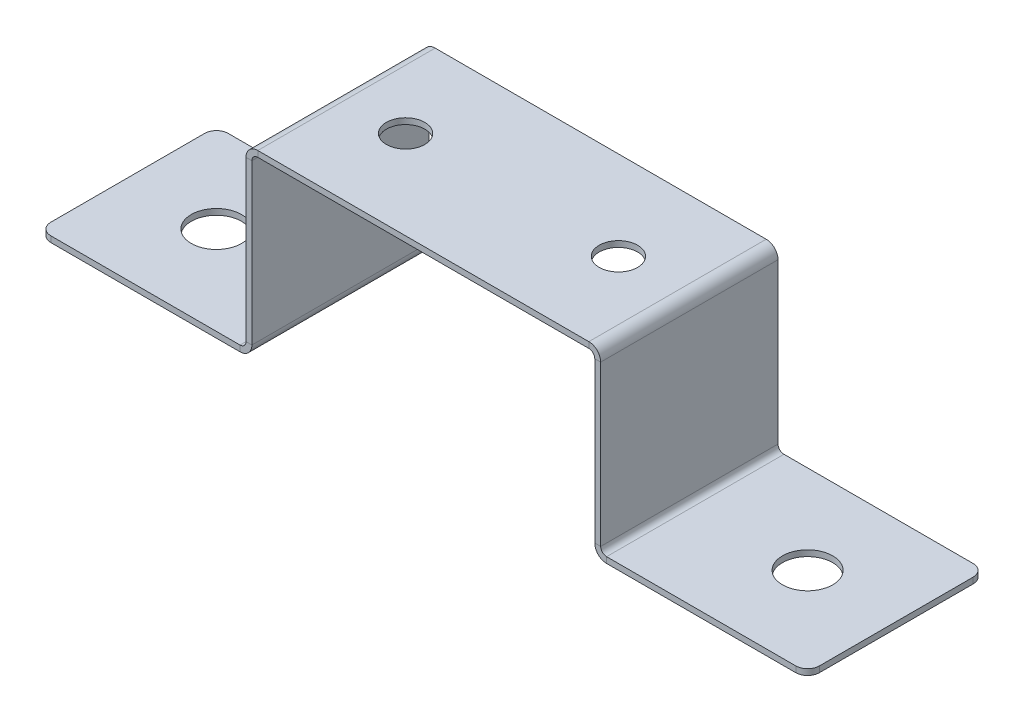
ISO-10303-21;
HEADER;
FILE_DESCRIPTION(('STEP AP214'),'2;1');
FILE_NAME('part.step','',(''),(''),'','','');
FILE_SCHEMA(('AUTOMOTIVE_DESIGN { 1 0 10303 214 1 1 1 1 }'));
ENDSEC;
DATA;
#1=APPLICATION_CONTEXT('core data for automotive mechanical design processes');
#2=APPLICATION_PROTOCOL_DEFINITION('international standard','automotive_design',2000,#1);
#3=PRODUCT_CONTEXT('',#1,'mechanical');
#4=PRODUCT('Part','Part','',(#3));
#5=PRODUCT_RELATED_PRODUCT_CATEGORY('part','',(#4));
#6=PRODUCT_DEFINITION_FORMATION('','',#4);
#7=PRODUCT_DEFINITION_CONTEXT('part definition',#1,'design');
#8=PRODUCT_DEFINITION('design','',#6,#7);
#9=PRODUCT_DEFINITION_SHAPE('','',#8);
#10=(LENGTH_UNIT() NAMED_UNIT(*) SI_UNIT(.MILLI.,.METRE.));
#11=(NAMED_UNIT(*) PLANE_ANGLE_UNIT() SI_UNIT($,.RADIAN.));
#12=(NAMED_UNIT(*) SI_UNIT($,.STERADIAN.) SOLID_ANGLE_UNIT());
#13=UNCERTAINTY_MEASURE_WITH_UNIT(LENGTH_MEASURE(1.E-05),#10,'distance_accuracy_value','');
#14=(GEOMETRIC_REPRESENTATION_CONTEXT(3) GLOBAL_UNCERTAINTY_ASSIGNED_CONTEXT((#13)) GLOBAL_UNIT_ASSIGNED_CONTEXT((#10,
#11,#12)) REPRESENTATION_CONTEXT('',''));
#15=CARTESIAN_POINT('',(0.,0.,0.));
#16=DIRECTION('',(0.,0.,1.));
#17=DIRECTION('',(1.,0.,0.));
#18=AXIS2_PLACEMENT_3D('',#15,#16,#17);
#19=CARTESIAN_POINT('',(65.,59.6862723900371,30.));
#20=DIRECTION('',(-1.,0.,0.));
#21=DIRECTION('',(0.,0.,1.));
#22=AXIS2_PLACEMENT_3D('',#19,#20,#21);
#23=PLANE('',#22);
#24=DIRECTION('',(0.,0.,-1.));
#25=VECTOR('',#24,1.);
#26=CARTESIAN_POINT('',(65.,-31.,30.));
#27=LINE('',#26,#25);
#28=CARTESIAN_POINT('',(65.,-31.,28.));
#29=VERTEX_POINT('',#28);
#30=CARTESIAN_POINT('',(65.,-31.,2.));
#31=VERTEX_POINT('',#30);
#32=EDGE_CURVE('E270',#29,#31,#27,.T.);
#33=ORIENTED_EDGE('',*,*,#32,.T.);
#34=DIRECTION('',(0.,-1.,0.));
#35=VECTOR('',#34,1.);
#36=CARTESIAN_POINT('',(65.,-30.,2.));
#37=LINE('',#36,#35);
#38=CARTESIAN_POINT('',(65.,-30.,2.));
#39=VERTEX_POINT('',#38);
#40=EDGE_CURVE('E286',#31,#39,#37,.F.);
#41=ORIENTED_EDGE('',*,*,#40,.T.);
#42=DIRECTION('',(0.,0.,-1.));
#43=VECTOR('',#42,1.);
#44=CARTESIAN_POINT('',(65.,-30.,30.));
#45=LINE('',#44,#43);
#46=CARTESIAN_POINT('',(65.,-30.,28.));
#47=VERTEX_POINT('',#46);
#48=EDGE_CURVE('E249',#47,#39,#45,.T.);
#49=ORIENTED_EDGE('',*,*,#48,.F.);
#50=DIRECTION('',(0.,-1.,0.));
#51=VECTOR('',#50,1.);
#52=CARTESIAN_POINT('',(65.,59.6862723900371,28.));
#53=LINE('',#52,#51);
#54=EDGE_CURVE('E283',#47,#29,#53,.T.);
#55=ORIENTED_EDGE('',*,*,#54,.T.);
#56=EDGE_LOOP('',(#33,#41,#49,#55));
#57=FACE_BOUND('',#56,.T.);
#58=ADVANCED_FACE('F37',(#57),#23,.F.);
#59=CARTESIAN_POINT('',(30.,59.6862723900371,30.));
#60=DIRECTION('',(0.,0.,-1.));
#61=DIRECTION('',(-1.,0.,0.));
#62=AXIS2_PLACEMENT_3D('',#59,#60,#61);
#63=PLANE('',#62);
#64=DIRECTION('',(1.,0.,0.));
#65=VECTOR('',#64,1.);
#66=CARTESIAN_POINT('',(30.,-31.,30.));
#67=LINE('',#66,#65);
#68=CARTESIAN_POINT('',(31.,-31.,30.));
#69=VERTEX_POINT('',#68);
#70=CARTESIAN_POINT('',(63.,-31.,30.));
#71=VERTEX_POINT('',#70);
#72=EDGE_CURVE('E264',#69,#71,#67,.T.);
#73=ORIENTED_EDGE('',*,*,#72,.T.);
#74=DIRECTION('',(0.,-1.,0.));
#75=VECTOR('',#74,1.);
#76=CARTESIAN_POINT('',(63.,59.6862723900371,30.));
#77=LINE('',#76,#75);
#78=CARTESIAN_POINT('',(63.,-30.,30.));
#79=VERTEX_POINT('',#78);
#80=EDGE_CURVE('E292',#71,#79,#77,.F.);
#81=ORIENTED_EDGE('',*,*,#80,.T.);
#82=DIRECTION('',(1.,0.,0.));
#83=VECTOR('',#82,1.);
#84=CARTESIAN_POINT('',(30.,-30.,30.));
#85=LINE('',#84,#83);
#86=CARTESIAN_POINT('',(31.,-30.,30.));
#87=VERTEX_POINT('',#86);
#88=EDGE_CURVE('E253',#87,#79,#85,.T.);
#89=ORIENTED_EDGE('',*,*,#88,.F.);
#90=DIRECTION('',(0.,-1.,0.));
#91=VECTOR('',#90,1.);
#92=CARTESIAN_POINT('',(31.,59.6862723900371,30.));
#93=LINE('',#92,#91);
#94=EDGE_CURVE('E267',#87,#69,#93,.T.);
#95=ORIENTED_EDGE('',*,*,#94,.T.);
#96=EDGE_LOOP('',(#73,#81,#89,#95));
#97=FACE_BOUND('',#96,.T.);
#98=ADVANCED_FACE('F490',(#97),#63,.F.);
#99=CARTESIAN_POINT('',(30.,-31.,30.));
#100=DIRECTION('',(0.,1.,0.));
#101=DIRECTION('',(0.,0.,1.));
#102=AXIS2_PLACEMENT_3D('',#99,#100,#101);
#103=PLANE('',#102);
#104=CARTESIAN_POINT('',(50.,-31.,15.));
#105=DIRECTION('',(0.,-1.,0.));
#106=DIRECTION('',(0.,0.,-1.));
#107=AXIS2_PLACEMENT_3D('',#104,#105,#106);
#108=CIRCLE('',#107,4.25000000000001);
#109=CARTESIAN_POINT('',(50.,-31.,10.75));
#110=VERTEX_POINT('',#109);
#111=EDGE_CURVE('E552',#110,#110,#108,.T.);
#112=ORIENTED_EDGE('',*,*,#111,.F.);
#113=EDGE_LOOP('',(#112));
#114=FACE_BOUND('',#113,.T.);
#115=DIRECTION('',(1.,0.,0.));
#116=VECTOR('',#115,1.);
#117=CARTESIAN_POINT('',(30.,-31.,0.));
#118=LINE('',#117,#116);
#119=CARTESIAN_POINT('',(31.,-31.,0.));
#120=VERTEX_POINT('',#119);
#121=CARTESIAN_POINT('',(63.,-31.,0.));
#122=VERTEX_POINT('',#121);
#123=EDGE_CURVE('E259',#120,#122,#118,.T.);
#124=ORIENTED_EDGE('',*,*,#123,.T.);
#125=CARTESIAN_POINT('',(63.,-31.,2.));
#126=DIRECTION('',(0.,1.,0.));
#127=DIRECTION('',(0.,0.,1.));
#128=AXIS2_PLACEMENT_3D('',#125,#126,#127);
#129=CIRCLE('',#128,2.);
#130=EDGE_CURVE('E281',#122,#31,#129,.F.);
#131=ORIENTED_EDGE('',*,*,#130,.T.);
#132=ORIENTED_EDGE('',*,*,#32,.F.);
#133=CARTESIAN_POINT('',(63.,-31.,28.));
#134=DIRECTION('',(0.,1.,0.));
#135=DIRECTION('',(0.,0.,1.));
#136=AXIS2_PLACEMENT_3D('',#133,#134,#135);
#137=CIRCLE('',#136,2.);
#138=EDGE_CURVE('E279',#29,#71,#137,.F.);
#139=ORIENTED_EDGE('',*,*,#138,.T.);
#140=ORIENTED_EDGE('',*,*,#72,.F.);
#141=DIRECTION('',(0.,0.,-1.));
#142=VECTOR('',#141,1.);
#143=CARTESIAN_POINT('',(31.,-31.,30.));
#144=LINE('',#143,#142);
#145=EDGE_CURVE('E262',#69,#120,#144,.T.);
#146=ORIENTED_EDGE('',*,*,#145,.T.);
#147=EDGE_LOOP('',(#124,#131,#132,#139,#140,#146));
#148=FACE_BOUND('',#147,.T.);
#149=ADVANCED_FACE('F496',(#114,#148),#103,.F.);
#150=CARTESIAN_POINT('',(30.,59.6862723900371,0.));
#151=DIRECTION('',(0.,0.,-1.));
#152=DIRECTION('',(-1.,0.,0.));
#153=AXIS2_PLACEMENT_3D('',#150,#151,#152);
#154=PLANE('',#153);
#155=DIRECTION('',(1.,0.,0.));
#156=VECTOR('',#155,1.);
#157=CARTESIAN_POINT('',(30.,-30.,0.));
#158=LINE('',#157,#156);
#159=CARTESIAN_POINT('',(31.,-30.,0.));
#160=VERTEX_POINT('',#159);
#161=CARTESIAN_POINT('',(63.,-30.,0.));
#162=VERTEX_POINT('',#161);
#163=EDGE_CURVE('E256',#160,#162,#158,.T.);
#164=ORIENTED_EDGE('',*,*,#163,.T.);
#165=DIRECTION('',(0.,-1.,0.));
#166=VECTOR('',#165,1.);
#167=CARTESIAN_POINT('',(63.,-31.,0.));
#168=LINE('',#167,#166);
#169=EDGE_CURVE('E252',#162,#122,#168,.T.);
#170=ORIENTED_EDGE('',*,*,#169,.T.);
#171=ORIENTED_EDGE('',*,*,#123,.F.);
#172=DIRECTION('',(0.,-1.,0.));
#173=VECTOR('',#172,1.);
#174=CARTESIAN_POINT('',(31.,59.6862723900371,0.));
#175=LINE('',#174,#173);
#176=EDGE_CURVE('E219',#160,#120,#175,.T.);
#177=ORIENTED_EDGE('',*,*,#176,.F.);
#178=EDGE_LOOP('',(#164,#170,#171,#177));
#179=FACE_BOUND('',#178,.T.);
#180=ADVANCED_FACE('F504',(#179),#154,.T.);
#181=CARTESIAN_POINT('',(30.,-30.,30.));
#182=DIRECTION('',(0.,1.,0.));
#183=DIRECTION('',(0.,0.,1.));
#184=AXIS2_PLACEMENT_3D('',#181,#182,#183);
#185=PLANE('',#184);
#186=CARTESIAN_POINT('',(50.,-30.,15.));
#187=DIRECTION('',(0.,1.,0.));
#188=DIRECTION('',(0.,0.,1.));
#189=AXIS2_PLACEMENT_3D('',#186,#187,#188);
#190=CIRCLE('',#189,4.25000000000001);
#191=CARTESIAN_POINT('',(50.,-30.,19.25));
#192=VERTEX_POINT('',#191);
#193=EDGE_CURVE('E549',#192,#192,#190,.F.);
#194=ORIENTED_EDGE('',*,*,#193,.T.);
#195=EDGE_LOOP('',(#194));
#196=FACE_BOUND('',#195,.T.);
#197=ORIENTED_EDGE('',*,*,#48,.T.);
#198=CARTESIAN_POINT('',(63.,-30.,2.));
#199=DIRECTION('',(0.,1.,0.));
#200=DIRECTION('',(0.,0.,1.));
#201=AXIS2_PLACEMENT_3D('',#198,#199,#200);
#202=CIRCLE('',#201,2.);
#203=EDGE_CURVE('E290',#39,#162,#202,.T.);
#204=ORIENTED_EDGE('',*,*,#203,.T.);
#205=ORIENTED_EDGE('',*,*,#163,.F.);
#206=DIRECTION('',(0.,0.,-1.));
#207=VECTOR('',#206,1.);
#208=CARTESIAN_POINT('',(31.,-30.,30.));
#209=LINE('',#208,#207);
#210=EDGE_CURVE('E274',#87,#160,#209,.T.);
#211=ORIENTED_EDGE('',*,*,#210,.F.);
#212=ORIENTED_EDGE('',*,*,#88,.T.);
#213=CARTESIAN_POINT('',(63.,-30.,28.));
#214=DIRECTION('',(0.,1.,0.));
#215=DIRECTION('',(0.,0.,1.));
#216=AXIS2_PLACEMENT_3D('',#213,#214,#215);
#217=CIRCLE('',#216,2.);
#218=EDGE_CURVE('E288',#79,#47,#217,.T.);
#219=ORIENTED_EDGE('',*,*,#218,.T.);
#220=EDGE_LOOP('',(#197,#204,#205,#211,#212,#219));
#221=FACE_BOUND('',#220,.T.);
#222=ADVANCED_FACE('F508',(#196,#221),#185,.T.);
#223=CARTESIAN_POINT('',(-51.7217442824423,0.,0.));
#224=DIRECTION('',(0.,0.,1.));
#225=DIRECTION('',(0.,-1.,0.));
#226=AXIS2_PLACEMENT_3D('',#223,#224,#225);
#227=PLANE('',#226);
#228=DIRECTION('',(0.,1.,0.));
#229=VECTOR('',#228,1.);
#230=CARTESIAN_POINT('',(30.,0.,0.));
#231=LINE('',#230,#229);
#232=CARTESIAN_POINT('',(30.,-29.,0.));
#233=VERTEX_POINT('',#232);
#234=CARTESIAN_POINT('',(30.,-1.99999999999999,0.));
#235=VERTEX_POINT('',#234);
#236=EDGE_CURVE('E234',#233,#235,#231,.T.);
#237=ORIENTED_EDGE('',*,*,#236,.F.);
#238=DIRECTION('',(1.,0.,0.));
#239=VECTOR('',#238,1.);
#240=CARTESIAN_POINT('',(-51.7217442824423,-29.,0.));
#241=LINE('',#240,#239);
#242=CARTESIAN_POINT('',(29.,-29.,0.));
#243=VERTEX_POINT('',#242);
#244=EDGE_CURVE('E216',#243,#233,#241,.T.);
#245=ORIENTED_EDGE('',*,*,#244,.F.);
#246=DIRECTION('',(0.,1.,0.));
#247=VECTOR('',#246,1.);
#248=CARTESIAN_POINT('',(29.,0.,0.));
#249=LINE('',#248,#247);
#250=CARTESIAN_POINT('',(29.,-1.99999999999999,0.));
#251=VERTEX_POINT('',#250);
#252=EDGE_CURVE('E224',#243,#251,#249,.T.);
#253=ORIENTED_EDGE('',*,*,#252,.T.);
#254=DIRECTION('',(1.,0.,0.));
#255=VECTOR('',#254,1.);
#256=CARTESIAN_POINT('',(-51.7217442824423,-1.99999999999999,0.));
#257=LINE('',#256,#255);
#258=EDGE_CURVE('E230',#251,#235,#257,.T.);
#259=ORIENTED_EDGE('',*,*,#258,.T.);
#260=EDGE_LOOP('',(#237,#245,#253,#259));
#261=FACE_BOUND('',#260,.T.);
#262=ADVANCED_FACE('F233',(#261),#227,.F.);
#263=CARTESIAN_POINT('',(30.,0.,30.));
#264=DIRECTION('',(1.,0.,0.));
#265=DIRECTION('',(0.,0.,-1.));
#266=AXIS2_PLACEMENT_3D('',#263,#264,#265);
#267=PLANE('',#266);
#268=DIRECTION('',(0.,0.,1.));
#269=VECTOR('',#268,1.);
#270=CARTESIAN_POINT('',(30.,-29.,30.));
#271=LINE('',#270,#269);
#272=CARTESIAN_POINT('',(30.,-29.,30.));
#273=VERTEX_POINT('',#272);
#274=EDGE_CURVE('E236',#233,#273,#271,.T.);
#275=ORIENTED_EDGE('',*,*,#274,.F.);
#276=ORIENTED_EDGE('',*,*,#236,.T.);
#277=DIRECTION('',(0.,0.,-1.));
#278=VECTOR('',#277,1.);
#279=CARTESIAN_POINT('',(30.,-1.99999999999999,0.));
#280=LINE('',#279,#278);
#281=CARTESIAN_POINT('',(30.,-2.,30.));
#282=VERTEX_POINT('',#281);
#283=EDGE_CURVE('E239',#282,#235,#280,.T.);
#284=ORIENTED_EDGE('',*,*,#283,.F.);
#285=DIRECTION('',(0.,-1.,0.));
#286=VECTOR('',#285,1.);
#287=CARTESIAN_POINT('',(30.,0.,30.));
#288=LINE('',#287,#286);
#289=EDGE_CURVE('E348',#282,#273,#288,.T.);
#290=ORIENTED_EDGE('',*,*,#289,.T.);
#291=EDGE_LOOP('',(#275,#276,#284,#290));
#292=FACE_BOUND('',#291,.T.);
#293=ADVANCED_FACE('F664',(#292),#267,.T.);
#294=CARTESIAN_POINT('',(-51.7217442824423,0.,30.));
#295=DIRECTION('',(0.,0.,1.));
#296=DIRECTION('',(0.,-1.,0.));
#297=AXIS2_PLACEMENT_3D('',#294,#295,#296);
#298=PLANE('',#297);
#299=DIRECTION('',(1.,0.,0.));
#300=VECTOR('',#299,1.);
#301=CARTESIAN_POINT('',(-51.7217442824423,-29.,30.));
#302=LINE('',#301,#300);
#303=CARTESIAN_POINT('',(29.,-29.,30.));
#304=VERTEX_POINT('',#303);
#305=EDGE_CURVE('E345',#304,#273,#302,.T.);
#306=ORIENTED_EDGE('',*,*,#305,.T.);
#307=ORIENTED_EDGE('',*,*,#289,.F.);
#308=DIRECTION('',(1.,0.,0.));
#309=VECTOR('',#308,1.);
#310=CARTESIAN_POINT('',(-51.7217442824423,-1.99999999999999,30.));
#311=LINE('',#310,#309);
#312=CARTESIAN_POINT('',(29.,-2.,30.));
#313=VERTEX_POINT('',#312);
#314=EDGE_CURVE('E245',#313,#282,#311,.T.);
#315=ORIENTED_EDGE('',*,*,#314,.F.);
#316=DIRECTION('',(0.,1.,0.));
#317=VECTOR('',#316,1.);
#318=CARTESIAN_POINT('',(29.,0.,30.));
#319=LINE('',#318,#317);
#320=EDGE_CURVE('E211',#313,#304,#319,.F.);
#321=ORIENTED_EDGE('',*,*,#320,.T.);
#322=EDGE_LOOP('',(#306,#307,#315,#321));
#323=FACE_BOUND('',#322,.T.);
#324=ADVANCED_FACE('F666',(#323),#298,.T.);
#325=CARTESIAN_POINT('',(29.,0.,30.));
#326=DIRECTION('',(1.,0.,0.));
#327=DIRECTION('',(0.,0.,-1.));
#328=AXIS2_PLACEMENT_3D('',#325,#326,#327);
#329=PLANE('',#328);
#330=ORIENTED_EDGE('',*,*,#252,.F.);
#331=DIRECTION('',(0.,0.,1.));
#332=VECTOR('',#331,1.);
#333=CARTESIAN_POINT('',(29.,-29.,30.));
#334=LINE('',#333,#332);
#335=EDGE_CURVE('E200',#243,#304,#334,.T.);
#336=ORIENTED_EDGE('',*,*,#335,.T.);
#337=ORIENTED_EDGE('',*,*,#320,.F.);
#338=DIRECTION('',(0.,0.,-1.));
#339=VECTOR('',#338,1.);
#340=CARTESIAN_POINT('',(29.,-1.99999999999999,0.));
#341=LINE('',#340,#339);
#342=EDGE_CURVE('E210',#313,#251,#341,.T.);
#343=ORIENTED_EDGE('',*,*,#342,.T.);
#344=EDGE_LOOP('',(#330,#336,#337,#343));
#345=FACE_BOUND('',#344,.T.);
#346=ADVANCED_FACE('F225',(#345),#329,.F.);
#347=CARTESIAN_POINT('',(-65.,59.6862723900371,30.));
#348=DIRECTION('',(-1.,0.,0.));
#349=DIRECTION('',(0.,0.,1.));
#350=AXIS2_PLACEMENT_3D('',#347,#348,#349);
#351=PLANE('',#350);
#352=DIRECTION('',(0.,0.,-1.));
#353=VECTOR('',#352,1.);
#354=CARTESIAN_POINT('',(-65.,-30.,30.));
#355=LINE('',#354,#353);
#356=CARTESIAN_POINT('',(-65.,-30.,28.));
#357=VERTEX_POINT('',#356);
#358=CARTESIAN_POINT('',(-65.,-30.,2.));
#359=VERTEX_POINT('',#358);
#360=EDGE_CURVE('E307',#357,#359,#355,.T.);
#361=ORIENTED_EDGE('',*,*,#360,.T.);
#362=DIRECTION('',(0.,-1.,0.));
#363=VECTOR('',#362,1.);
#364=CARTESIAN_POINT('',(-65.,59.6862723900371,2.));
#365=LINE('',#364,#363);
#366=CARTESIAN_POINT('',(-65.,-31.,2.));
#367=VERTEX_POINT('',#366);
#368=EDGE_CURVE('E296',#359,#367,#365,.T.);
#369=ORIENTED_EDGE('',*,*,#368,.T.);
#370=DIRECTION('',(0.,0.,-1.));
#371=VECTOR('',#370,1.);
#372=CARTESIAN_POINT('',(-65.,-31.,30.));
#373=LINE('',#372,#371);
#374=CARTESIAN_POINT('',(-65.,-31.,28.));
#375=VERTEX_POINT('',#374);
#376=EDGE_CURVE('E325',#375,#367,#373,.T.);
#377=ORIENTED_EDGE('',*,*,#376,.F.);
#378=DIRECTION('',(0.,-1.,0.));
#379=VECTOR('',#378,1.);
#380=CARTESIAN_POINT('',(-65.,-30.,28.));
#381=LINE('',#380,#379);
#382=EDGE_CURVE('E294',#375,#357,#381,.F.);
#383=ORIENTED_EDGE('',*,*,#382,.T.);
#384=EDGE_LOOP('',(#361,#369,#377,#383));
#385=FACE_BOUND('',#384,.T.);
#386=ADVANCED_FACE('F313',(#385),#351,.T.);
#387=CARTESIAN_POINT('',(-65.,59.6862723900371,0.));
#388=DIRECTION('',(0.,0.,-1.));
#389=DIRECTION('',(-1.,0.,0.));
#390=AXIS2_PLACEMENT_3D('',#387,#388,#389);
#391=PLANE('',#390);
#392=DIRECTION('',(1.,0.,0.));
#393=VECTOR('',#392,1.);
#394=CARTESIAN_POINT('',(-65.,-31.,0.));
#395=LINE('',#394,#393);
#396=CARTESIAN_POINT('',(-63.,-31.,0.));
#397=VERTEX_POINT('',#396);
#398=CARTESIAN_POINT('',(-31.,-31.,0.));
#399=VERTEX_POINT('',#398);
#400=EDGE_CURVE('E323',#397,#399,#395,.T.);
#401=ORIENTED_EDGE('',*,*,#400,.F.);
#402=DIRECTION('',(0.,-1.,0.));
#403=VECTOR('',#402,1.);
#404=CARTESIAN_POINT('',(-63.,59.6862723900371,0.));
#405=LINE('',#404,#403);
#406=CARTESIAN_POINT('',(-63.,-30.,0.));
#407=VERTEX_POINT('',#406);
#408=EDGE_CURVE('E60',#397,#407,#405,.F.);
#409=ORIENTED_EDGE('',*,*,#408,.T.);
#410=DIRECTION('',(1.,0.,0.));
#411=VECTOR('',#410,1.);
#412=CARTESIAN_POINT('',(-65.,-30.,0.));
#413=LINE('',#412,#411);
#414=CARTESIAN_POINT('',(-31.,-30.,0.));
#415=VERTEX_POINT('',#414);
#416=EDGE_CURVE('E309',#407,#415,#413,.T.);
#417=ORIENTED_EDGE('',*,*,#416,.T.);
#418=DIRECTION('',(0.,-1.,0.));
#419=VECTOR('',#418,1.);
#420=CARTESIAN_POINT('',(-31.,59.6862723900371,0.));
#421=LINE('',#420,#419);
#422=EDGE_CURVE('E329',#415,#399,#421,.T.);
#423=ORIENTED_EDGE('',*,*,#422,.T.);
#424=EDGE_LOOP('',(#401,#409,#417,#423));
#425=FACE_BOUND('',#424,.T.);
#426=ADVANCED_FACE('F327',(#425),#391,.T.);
#427=CARTESIAN_POINT('',(-65.,-31.,30.));
#428=DIRECTION('',(0.,1.,0.));
#429=DIRECTION('',(0.,0.,1.));
#430=AXIS2_PLACEMENT_3D('',#427,#428,#429);
#431=PLANE('',#430);
#432=CARTESIAN_POINT('',(-50.,-31.,15.));
#433=DIRECTION('',(0.,-1.,0.));
#434=DIRECTION('',(0.,0.,-1.));
#435=AXIS2_PLACEMENT_3D('',#432,#433,#434);
#436=CIRCLE('',#435,4.25);
#437=CARTESIAN_POINT('',(-50.,-31.,10.75));
#438=VERTEX_POINT('',#437);
#439=EDGE_CURVE('E543',#438,#438,#436,.T.);
#440=ORIENTED_EDGE('',*,*,#439,.F.);
#441=EDGE_LOOP('',(#440));
#442=FACE_BOUND('',#441,.T.);
#443=ORIENTED_EDGE('',*,*,#376,.T.);
#444=CARTESIAN_POINT('',(-63.,-31.,2.));
#445=DIRECTION('',(0.,1.,0.));
#446=DIRECTION('',(0.,0.,1.));
#447=AXIS2_PLACEMENT_3D('',#444,#445,#446);
#448=CIRCLE('',#447,2.);
#449=EDGE_CURVE('E301',#367,#397,#448,.F.);
#450=ORIENTED_EDGE('',*,*,#449,.T.);
#451=ORIENTED_EDGE('',*,*,#400,.T.);
#452=DIRECTION('',(0.,0.,1.));
#453=VECTOR('',#452,1.);
#454=CARTESIAN_POINT('',(-31.,-31.,0.));
#455=LINE('',#454,#453);
#456=CARTESIAN_POINT('',(-31.,-31.,30.));
#457=VERTEX_POINT('',#456);
#458=EDGE_CURVE('E330',#399,#457,#455,.T.);
#459=ORIENTED_EDGE('',*,*,#458,.T.);
#460=DIRECTION('',(1.,0.,0.));
#461=VECTOR('',#460,1.);
#462=CARTESIAN_POINT('',(-65.,-31.,30.));
#463=LINE('',#462,#461);
#464=CARTESIAN_POINT('',(-63.,-31.,30.));
#465=VERTEX_POINT('',#464);
#466=EDGE_CURVE('E465',#465,#457,#463,.T.);
#467=ORIENTED_EDGE('',*,*,#466,.F.);
#468=CARTESIAN_POINT('',(-63.,-31.,28.));
#469=DIRECTION('',(0.,1.,0.));
#470=DIRECTION('',(0.,0.,1.));
#471=AXIS2_PLACEMENT_3D('',#468,#469,#470);
#472=CIRCLE('',#471,2.);
#473=EDGE_CURVE('E299',#465,#375,#472,.F.);
#474=ORIENTED_EDGE('',*,*,#473,.T.);
#475=EDGE_LOOP('',(#443,#450,#451,#459,#467,#474));
#476=FACE_BOUND('',#475,.T.);
#477=ADVANCED_FACE('F321',(#442,#476),#431,.F.);
#478=CARTESIAN_POINT('',(-65.,59.6862723900371,30.));
#479=DIRECTION('',(0.,0.,-1.));
#480=DIRECTION('',(-1.,0.,0.));
#481=AXIS2_PLACEMENT_3D('',#478,#479,#480);
#482=PLANE('',#481);
#483=DIRECTION('',(1.,0.,0.));
#484=VECTOR('',#483,1.);
#485=CARTESIAN_POINT('',(-65.,-30.,30.));
#486=LINE('',#485,#484);
#487=CARTESIAN_POINT('',(-63.,-30.,30.));
#488=VERTEX_POINT('',#487);
#489=CARTESIAN_POINT('',(-31.,-30.,30.));
#490=VERTEX_POINT('',#489);
#491=EDGE_CURVE('E248',#488,#490,#486,.T.);
#492=ORIENTED_EDGE('',*,*,#491,.F.);
#493=DIRECTION('',(0.,-1.,0.));
#494=VECTOR('',#493,1.);
#495=CARTESIAN_POINT('',(-63.,-31.,30.));
#496=LINE('',#495,#494);
#497=EDGE_CURVE('E11',#488,#465,#496,.T.);
#498=ORIENTED_EDGE('',*,*,#497,.T.);
#499=ORIENTED_EDGE('',*,*,#466,.T.);
#500=DIRECTION('',(0.,-1.,0.));
#501=VECTOR('',#500,1.);
#502=CARTESIAN_POINT('',(-31.,59.6862723900371,30.));
#503=LINE('',#502,#501);
#504=EDGE_CURVE('E317',#490,#457,#503,.T.);
#505=ORIENTED_EDGE('',*,*,#504,.F.);
#506=EDGE_LOOP('',(#492,#498,#499,#505));
#507=FACE_BOUND('',#506,.T.);
#508=ADVANCED_FACE('F470',(#507),#482,.F.);
#509=CARTESIAN_POINT('',(-65.,-30.,30.));
#510=DIRECTION('',(0.,1.,0.));
#511=DIRECTION('',(0.,0.,1.));
#512=AXIS2_PLACEMENT_3D('',#509,#510,#511);
#513=PLANE('',#512);
#514=CARTESIAN_POINT('',(-50.,-30.,15.));
#515=DIRECTION('',(0.,1.,0.));
#516=DIRECTION('',(0.,0.,1.));
#517=AXIS2_PLACEMENT_3D('',#514,#515,#516);
#518=CIRCLE('',#517,4.25);
#519=CARTESIAN_POINT('',(-50.,-30.,19.25));
#520=VERTEX_POINT('',#519);
#521=EDGE_CURVE('E545',#520,#520,#518,.F.);
#522=ORIENTED_EDGE('',*,*,#521,.T.);
#523=EDGE_LOOP('',(#522));
#524=FACE_BOUND('',#523,.T.);
#525=ORIENTED_EDGE('',*,*,#416,.F.);
#526=CARTESIAN_POINT('',(-63.,-30.,2.));
#527=DIRECTION('',(0.,1.,0.));
#528=DIRECTION('',(0.,0.,1.));
#529=AXIS2_PLACEMENT_3D('',#526,#527,#528);
#530=CIRCLE('',#529,2.);
#531=EDGE_CURVE('E45',#407,#359,#530,.T.);
#532=ORIENTED_EDGE('',*,*,#531,.T.);
#533=ORIENTED_EDGE('',*,*,#360,.F.);
#534=CARTESIAN_POINT('',(-63.,-30.,28.));
#535=DIRECTION('',(0.,1.,0.));
#536=DIRECTION('',(0.,0.,1.));
#537=AXIS2_PLACEMENT_3D('',#534,#535,#536);
#538=CIRCLE('',#537,2.);
#539=EDGE_CURVE('E52',#357,#488,#538,.T.);
#540=ORIENTED_EDGE('',*,*,#539,.T.);
#541=ORIENTED_EDGE('',*,*,#491,.T.);
#542=DIRECTION('',(0.,0.,1.));
#543=VECTOR('',#542,1.);
#544=CARTESIAN_POINT('',(-31.,-30.,0.));
#545=LINE('',#544,#543);
#546=EDGE_CURVE('E339',#415,#490,#545,.T.);
#547=ORIENTED_EDGE('',*,*,#546,.F.);
#548=EDGE_LOOP('',(#525,#532,#533,#540,#541,#547));
#549=FACE_BOUND('',#548,.T.);
#550=ADVANCED_FACE('F306',(#524,#549),#513,.T.);
#551=CARTESIAN_POINT('',(51.7217442824423,-30.,30.));
#552=DIRECTION('',(0.,0.,1.));
#553=DIRECTION('',(0.,1.,0.));
#554=AXIS2_PLACEMENT_3D('',#551,#552,#553);
#555=PLANE('',#554);
#556=DIRECTION('',(-1.,0.,0.));
#557=VECTOR('',#556,1.);
#558=CARTESIAN_POINT('',(51.7217442824423,-1.99999999999999,30.));
#559=LINE('',#558,#557);
#560=CARTESIAN_POINT('',(-29.,-1.99999999999999,30.));
#561=VERTEX_POINT('',#560);
#562=CARTESIAN_POINT('',(-30.,-1.99999999999999,30.));
#563=VERTEX_POINT('',#562);
#564=EDGE_CURVE('E452',#561,#563,#559,.T.);
#565=ORIENTED_EDGE('',*,*,#564,.T.);
#566=DIRECTION('',(0.,-1.,0.));
#567=VECTOR('',#566,1.);
#568=CARTESIAN_POINT('',(-30.,-30.,30.));
#569=LINE('',#568,#567);
#570=CARTESIAN_POINT('',(-30.,-29.,30.));
#571=VERTEX_POINT('',#570);
#572=EDGE_CURVE('E449',#563,#571,#569,.T.);
#573=ORIENTED_EDGE('',*,*,#572,.T.);
#574=DIRECTION('',(-1.,0.,0.));
#575=VECTOR('',#574,1.);
#576=CARTESIAN_POINT('',(51.7217442824423,-29.,30.));
#577=LINE('',#576,#575);
#578=CARTESIAN_POINT('',(-29.,-29.,30.));
#579=VERTEX_POINT('',#578);
#580=EDGE_CURVE('E454',#579,#571,#577,.T.);
#581=ORIENTED_EDGE('',*,*,#580,.F.);
#582=DIRECTION('',(0.,-1.,0.));
#583=VECTOR('',#582,1.);
#584=CARTESIAN_POINT('',(-29.,-30.,30.));
#585=LINE('',#584,#583);
#586=EDGE_CURVE('E440',#561,#579,#585,.T.);
#587=ORIENTED_EDGE('',*,*,#586,.F.);
#588=EDGE_LOOP('',(#565,#573,#581,#587));
#589=FACE_BOUND('',#588,.T.);
#590=ADVANCED_FACE('F613',(#589),#555,.T.);
#591=CARTESIAN_POINT('',(-30.,-30.,30.));
#592=DIRECTION('',(-1.,0.,0.));
#593=DIRECTION('',(0.,0.,1.));
#594=AXIS2_PLACEMENT_3D('',#591,#592,#593);
#595=PLANE('',#594);
#596=DIRECTION('',(0.,0.,-1.));
#597=VECTOR('',#596,1.);
#598=CARTESIAN_POINT('',(-30.,-29.,0.));
#599=LINE('',#598,#597);
#600=CARTESIAN_POINT('',(-30.,-29.,0.));
#601=VERTEX_POINT('',#600);
#602=EDGE_CURVE('E456',#571,#601,#599,.T.);
#603=ORIENTED_EDGE('',*,*,#602,.F.);
#604=ORIENTED_EDGE('',*,*,#572,.F.);
#605=DIRECTION('',(0.,0.,1.));
#606=VECTOR('',#605,1.);
#607=CARTESIAN_POINT('',(-30.,-1.99999999999999,30.));
#608=LINE('',#607,#606);
#609=CARTESIAN_POINT('',(-30.,-2.,0.));
#610=VERTEX_POINT('',#609);
#611=EDGE_CURVE('E459',#610,#563,#608,.T.);
#612=ORIENTED_EDGE('',*,*,#611,.F.);
#613=DIRECTION('',(0.,1.,0.));
#614=VECTOR('',#613,1.);
#615=CARTESIAN_POINT('',(-30.,-30.,0.));
#616=LINE('',#615,#614);
#617=EDGE_CURVE('E446',#601,#610,#616,.T.);
#618=ORIENTED_EDGE('',*,*,#617,.F.);
#619=EDGE_LOOP('',(#603,#604,#612,#618));
#620=FACE_BOUND('',#619,.T.);
#621=ADVANCED_FACE('F615',(#620),#595,.T.);
#622=CARTESIAN_POINT('',(51.7217442824423,-30.,0.));
#623=DIRECTION('',(0.,0.,1.));
#624=DIRECTION('',(0.,1.,0.));
#625=AXIS2_PLACEMENT_3D('',#622,#623,#624);
#626=PLANE('',#625);
#627=ORIENTED_EDGE('',*,*,#617,.T.);
#628=DIRECTION('',(-1.,0.,0.));
#629=VECTOR('',#628,1.);
#630=CARTESIAN_POINT('',(51.7217442824423,-1.99999999999999,0.));
#631=LINE('',#630,#629);
#632=CARTESIAN_POINT('',(-29.,-2.,0.));
#633=VERTEX_POINT('',#632);
#634=EDGE_CURVE('E431',#633,#610,#631,.T.);
#635=ORIENTED_EDGE('',*,*,#634,.F.);
#636=DIRECTION('',(0.,1.,0.));
#637=VECTOR('',#636,1.);
#638=CARTESIAN_POINT('',(-29.,-30.,0.));
#639=LINE('',#638,#637);
#640=CARTESIAN_POINT('',(-29.,-29.,0.));
#641=VERTEX_POINT('',#640);
#642=EDGE_CURVE('E434',#641,#633,#639,.T.);
#643=ORIENTED_EDGE('',*,*,#642,.F.);
#644=DIRECTION('',(-1.,0.,0.));
#645=VECTOR('',#644,1.);
#646=CARTESIAN_POINT('',(51.7217442824423,-29.,0.));
#647=LINE('',#646,#645);
#648=EDGE_CURVE('E443',#641,#601,#647,.T.);
#649=ORIENTED_EDGE('',*,*,#648,.T.);
#650=EDGE_LOOP('',(#627,#635,#643,#649));
#651=FACE_BOUND('',#650,.T.);
#652=ADVANCED_FACE('F644',(#651),#626,.F.);
#653=CARTESIAN_POINT('',(-29.,-30.,30.));
#654=DIRECTION('',(-1.,0.,0.));
#655=DIRECTION('',(0.,0.,1.));
#656=AXIS2_PLACEMENT_3D('',#653,#654,#655);
#657=PLANE('',#656);
#658=ORIENTED_EDGE('',*,*,#586,.T.);
#659=DIRECTION('',(0.,0.,-1.));
#660=VECTOR('',#659,1.);
#661=CARTESIAN_POINT('',(-29.,-29.,0.));
#662=LINE('',#661,#660);
#663=EDGE_CURVE('E437',#579,#641,#662,.T.);
#664=ORIENTED_EDGE('',*,*,#663,.T.);
#665=ORIENTED_EDGE('',*,*,#642,.T.);
#666=DIRECTION('',(0.,0.,1.));
#667=VECTOR('',#666,1.);
#668=CARTESIAN_POINT('',(-29.,-1.99999999999999,30.));
#669=LINE('',#668,#667);
#670=EDGE_CURVE('E342',#633,#561,#669,.T.);
#671=ORIENTED_EDGE('',*,*,#670,.T.);
#672=EDGE_LOOP('',(#658,#664,#665,#671));
#673=FACE_BOUND('',#672,.T.);
#674=ADVANCED_FACE('F607',(#673),#657,.F.);
#675=CARTESIAN_POINT('',(-30.,-128.059041394149,0.));
#676=DIRECTION('',(0.,0.,1.));
#677=DIRECTION('',(1.,0.,0.));
#678=AXIS2_PLACEMENT_3D('',#675,#676,#677);
#679=PLANE('',#678);
#680=DIRECTION('',(1.,0.,0.));
#681=VECTOR('',#680,1.);
#682=CARTESIAN_POINT('',(-30.,0.,0.));
#683=LINE('',#682,#681);
#684=CARTESIAN_POINT('',(-28.,0.,0.));
#685=VERTEX_POINT('',#684);
#686=CARTESIAN_POINT('',(28.,0.,0.));
#687=VERTEX_POINT('',#686);
#688=EDGE_CURVE('E396',#685,#687,#683,.T.);
#689=ORIENTED_EDGE('',*,*,#688,.T.);
#690=DIRECTION('',(0.,1.,0.));
#691=VECTOR('',#690,1.);
#692=CARTESIAN_POINT('',(28.,-128.059041394149,0.));
#693=LINE('',#692,#691);
#694=CARTESIAN_POINT('',(28.,-1.,0.));
#695=VERTEX_POINT('',#694);
#696=EDGE_CURVE('E366',#695,#687,#693,.T.);
#697=ORIENTED_EDGE('',*,*,#696,.F.);
#698=DIRECTION('',(1.,0.,0.));
#699=VECTOR('',#698,1.);
#700=CARTESIAN_POINT('',(-30.,-1.,0.));
#701=LINE('',#700,#699);
#702=CARTESIAN_POINT('',(-28.,-1.,0.));
#703=VERTEX_POINT('',#702);
#704=EDGE_CURVE('E407',#703,#695,#701,.T.);
#705=ORIENTED_EDGE('',*,*,#704,.F.);
#706=DIRECTION('',(0.,1.,0.));
#707=VECTOR('',#706,1.);
#708=CARTESIAN_POINT('',(-28.,-128.059041394149,0.));
#709=LINE('',#708,#707);
#710=EDGE_CURVE('E416',#703,#685,#709,.T.);
#711=ORIENTED_EDGE('',*,*,#710,.T.);
#712=EDGE_LOOP('',(#689,#697,#705,#711));
#713=FACE_BOUND('',#712,.T.);
#714=ADVANCED_FACE('F596',(#713),#679,.F.);
#715=CARTESIAN_POINT('',(-30.,-128.059041394149,30.));
#716=DIRECTION('',(0.,0.,1.));
#717=DIRECTION('',(1.,0.,0.));
#718=AXIS2_PLACEMENT_3D('',#715,#716,#717);
#719=PLANE('',#718);
#720=DIRECTION('',(0.,1.,0.));
#721=VECTOR('',#720,1.);
#722=CARTESIAN_POINT('',(28.,-128.059041394149,30.));
#723=LINE('',#722,#721);
#724=CARTESIAN_POINT('',(28.,-1.,30.));
#725=VERTEX_POINT('',#724);
#726=CARTESIAN_POINT('',(28.,0.,30.));
#727=VERTEX_POINT('',#726);
#728=EDGE_CURVE('E421',#725,#727,#723,.T.);
#729=ORIENTED_EDGE('',*,*,#728,.T.);
#730=DIRECTION('',(1.,0.,0.));
#731=VECTOR('',#730,1.);
#732=CARTESIAN_POINT('',(-30.,0.,30.));
#733=LINE('',#732,#731);
#734=CARTESIAN_POINT('',(-28.,0.,30.));
#735=VERTEX_POINT('',#734);
#736=EDGE_CURVE('E402',#735,#727,#733,.T.);
#737=ORIENTED_EDGE('',*,*,#736,.F.);
#738=DIRECTION('',(0.,1.,0.));
#739=VECTOR('',#738,1.);
#740=CARTESIAN_POINT('',(-28.,-128.059041394149,30.));
#741=LINE('',#740,#739);
#742=CARTESIAN_POINT('',(-28.,-1.,30.));
#743=VERTEX_POINT('',#742);
#744=EDGE_CURVE('E419',#743,#735,#741,.T.);
#745=ORIENTED_EDGE('',*,*,#744,.F.);
#746=DIRECTION('',(1.,0.,0.));
#747=VECTOR('',#746,1.);
#748=CARTESIAN_POINT('',(-30.,-1.,30.));
#749=LINE('',#748,#747);
#750=EDGE_CURVE('E410',#743,#725,#749,.T.);
#751=ORIENTED_EDGE('',*,*,#750,.T.);
#752=EDGE_LOOP('',(#729,#737,#745,#751));
#753=FACE_BOUND('',#752,.T.);
#754=ADVANCED_FACE('F584',(#753),#719,.T.);
#755=CARTESIAN_POINT('',(-30.,-1.,30.));
#756=DIRECTION('',(0.,1.,0.));
#757=DIRECTION('',(0.,0.,1.));
#758=AXIS2_PLACEMENT_3D('',#755,#756,#757);
#759=PLANE('',#758);
#760=CARTESIAN_POINT('',(-18.,-1.,15.));
#761=DIRECTION('',(0.,1.,0.));
#762=DIRECTION('',(0.,0.,1.));
#763=AXIS2_PLACEMENT_3D('',#760,#761,#762);
#764=CIRCLE('',#763,3.25);
#765=CARTESIAN_POINT('',(-18.,-1.,18.25));
#766=VERTEX_POINT('',#765);
#767=EDGE_CURVE('E553',#766,#766,#764,.F.);
#768=ORIENTED_EDGE('',*,*,#767,.F.);
#769=EDGE_LOOP('',(#768));
#770=FACE_BOUND('',#769,.T.);
#771=CARTESIAN_POINT('',(18.,-1.,15.));
#772=DIRECTION('',(0.,1.,0.));
#773=DIRECTION('',(0.,0.,1.));
#774=AXIS2_PLACEMENT_3D('',#771,#772,#773);
#775=CIRCLE('',#774,3.25);
#776=CARTESIAN_POINT('',(18.,-1.,18.25));
#777=VERTEX_POINT('',#776);
#778=EDGE_CURVE('E558',#777,#777,#775,.F.);
#779=ORIENTED_EDGE('',*,*,#778,.F.);
#780=EDGE_LOOP('',(#779));
#781=FACE_BOUND('',#780,.T.);
#782=DIRECTION('',(0.,0.,-1.));
#783=VECTOR('',#782,1.);
#784=CARTESIAN_POINT('',(28.,-1.,0.));
#785=LINE('',#784,#783);
#786=EDGE_CURVE('E413',#725,#695,#785,.T.);
#787=ORIENTED_EDGE('',*,*,#786,.F.);
#788=ORIENTED_EDGE('',*,*,#750,.F.);
#789=DIRECTION('',(0.,0.,1.));
#790=VECTOR('',#789,1.);
#791=CARTESIAN_POINT('',(-28.,-1.,30.));
#792=LINE('',#791,#790);
#793=EDGE_CURVE('E425',#703,#743,#792,.T.);
#794=ORIENTED_EDGE('',*,*,#793,.F.);
#795=ORIENTED_EDGE('',*,*,#704,.T.);
#796=EDGE_LOOP('',(#787,#788,#794,#795));
#797=FACE_BOUND('',#796,.T.);
#798=ADVANCED_FACE('F576',(#770,#781,#797),#759,.F.);
#799=CARTESIAN_POINT('',(-30.,0.,30.));
#800=DIRECTION('',(0.,1.,0.));
#801=DIRECTION('',(0.,0.,1.));
#802=AXIS2_PLACEMENT_3D('',#799,#800,#801);
#803=PLANE('',#802);
#804=CARTESIAN_POINT('',(-18.,0.,15.));
#805=DIRECTION('',(0.,1.,0.));
#806=DIRECTION('',(0.,0.,1.));
#807=AXIS2_PLACEMENT_3D('',#804,#805,#806);
#808=CIRCLE('',#807,3.25);
#809=CARTESIAN_POINT('',(-18.,0.,18.25));
#810=VERTEX_POINT('',#809);
#811=EDGE_CURVE('E561',#810,#810,#808,.T.);
#812=ORIENTED_EDGE('',*,*,#811,.F.);
#813=EDGE_LOOP('',(#812));
#814=FACE_BOUND('',#813,.T.);
#815=CARTESIAN_POINT('',(18.,0.,15.));
#816=DIRECTION('',(0.,1.,0.));
#817=DIRECTION('',(0.,0.,1.));
#818=AXIS2_PLACEMENT_3D('',#815,#816,#817);
#819=CIRCLE('',#818,3.25);
#820=CARTESIAN_POINT('',(18.,0.,18.25));
#821=VERTEX_POINT('',#820);
#822=EDGE_CURVE('E562',#821,#821,#819,.T.);
#823=ORIENTED_EDGE('',*,*,#822,.F.);
#824=EDGE_LOOP('',(#823));
#825=FACE_BOUND('',#824,.T.);
#826=ORIENTED_EDGE('',*,*,#736,.T.);
#827=DIRECTION('',(0.,0.,-1.));
#828=VECTOR('',#827,1.);
#829=CARTESIAN_POINT('',(28.,0.,0.));
#830=LINE('',#829,#828);
#831=EDGE_CURVE('E405',#727,#687,#830,.T.);
#832=ORIENTED_EDGE('',*,*,#831,.T.);
#833=ORIENTED_EDGE('',*,*,#688,.F.);
#834=DIRECTION('',(0.,0.,1.));
#835=VECTOR('',#834,1.);
#836=CARTESIAN_POINT('',(-28.,0.,30.));
#837=LINE('',#836,#835);
#838=EDGE_CURVE('E428',#685,#735,#837,.T.);
#839=ORIENTED_EDGE('',*,*,#838,.T.);
#840=EDGE_LOOP('',(#826,#832,#833,#839));
#841=FACE_BOUND('',#840,.T.);
#842=ADVANCED_FACE('F572',(#814,#825,#841),#803,.T.);
#843=CARTESIAN_POINT('',(-28.,-2.,30.));
#844=DIRECTION('',(0.,0.,1.));
#845=DIRECTION('',(1.,0.,0.));
#846=AXIS2_PLACEMENT_3D('',#843,#844,#845);
#847=PLANE('',#846);
#848=ORIENTED_EDGE('',*,*,#564,.F.);
#849=CARTESIAN_POINT('',(-28.,-2.,30.));
#850=DIRECTION('',(0.,0.,-1.));
#851=DIRECTION('',(-1.,0.,0.));
#852=AXIS2_PLACEMENT_3D('',#849,#850,#851);
#853=CIRCLE('',#852,1.);
#854=EDGE_CURVE('E384',#561,#743,#853,.T.);
#855=ORIENTED_EDGE('',*,*,#854,.T.);
#856=ORIENTED_EDGE('',*,*,#744,.T.);
#857=CARTESIAN_POINT('',(-28.,-2.,30.));
#858=DIRECTION('',(0.,0.,-1.));
#859=DIRECTION('',(-1.,0.,0.));
#860=AXIS2_PLACEMENT_3D('',#857,#858,#859);
#861=CIRCLE('',#860,2.);
#862=EDGE_CURVE('E389',#563,#735,#861,.T.);
#863=ORIENTED_EDGE('',*,*,#862,.F.);
#864=EDGE_LOOP('',(#848,#855,#856,#863));
#865=FACE_BOUND('',#864,.T.);
#866=ADVANCED_FACE('F575',(#865),#847,.T.);
#867=CARTESIAN_POINT('',(-28.,-2.,0.));
#868=DIRECTION('',(0.,0.,-1.));
#869=DIRECTION('',(-1.,0.,0.));
#870=AXIS2_PLACEMENT_3D('',#867,#868,#869);
#871=PLANE('',#870);
#872=CARTESIAN_POINT('',(-28.,-2.,0.));
#873=DIRECTION('',(0.,0.,-1.));
#874=DIRECTION('',(-1.,0.,0.));
#875=AXIS2_PLACEMENT_3D('',#872,#873,#874);
#876=CIRCLE('',#875,1.);
#877=EDGE_CURVE('E393',#703,#633,#876,.F.);
#878=ORIENTED_EDGE('',*,*,#877,.T.);
#879=ORIENTED_EDGE('',*,*,#634,.T.);
#880=CARTESIAN_POINT('',(-28.,-2.,0.));
#881=DIRECTION('',(0.,0.,-1.));
#882=DIRECTION('',(-1.,0.,0.));
#883=AXIS2_PLACEMENT_3D('',#880,#881,#882);
#884=CIRCLE('',#883,2.);
#885=EDGE_CURVE('E392',#685,#610,#884,.F.);
#886=ORIENTED_EDGE('',*,*,#885,.F.);
#887=ORIENTED_EDGE('',*,*,#710,.F.);
#888=EDGE_LOOP('',(#878,#879,#886,#887));
#889=FACE_BOUND('',#888,.T.);
#890=ADVANCED_FACE('F600',(#889),#871,.T.);
#891=CARTESIAN_POINT('',(-28.,-2.,219.813190778838));
#892=DIRECTION('',(0.,0.,-1.));
#893=DIRECTION('',(-1.,0.,0.));
#894=AXIS2_PLACEMENT_3D('',#891,#892,#893);
#895=CYLINDRICAL_SURFACE('',#894,2.);
#896=ORIENTED_EDGE('',*,*,#838,.F.);
#897=ORIENTED_EDGE('',*,*,#885,.T.);
#898=ORIENTED_EDGE('',*,*,#611,.T.);
#899=ORIENTED_EDGE('',*,*,#862,.T.);
#900=EDGE_LOOP('',(#896,#897,#898,#899));
#901=FACE_BOUND('',#900,.T.);
#902=ADVANCED_FACE('F618',(#901),#895,.T.);
#903=CARTESIAN_POINT('',(-28.,-2.,219.813190778838));
#904=DIRECTION('',(0.,0.,-1.));
#905=DIRECTION('',(-1.,0.,0.));
#906=AXIS2_PLACEMENT_3D('',#903,#904,#905);
#907=CYLINDRICAL_SURFACE('',#906,1.);
#908=ORIENTED_EDGE('',*,*,#793,.T.);
#909=ORIENTED_EDGE('',*,*,#854,.F.);
#910=ORIENTED_EDGE('',*,*,#670,.F.);
#911=ORIENTED_EDGE('',*,*,#877,.F.);
#912=EDGE_LOOP('',(#908,#909,#910,#911));
#913=FACE_BOUND('',#912,.T.);
#914=ADVANCED_FACE('F603',(#913),#907,.F.);
#915=CARTESIAN_POINT('',(-31.,-29.,30.));
#916=DIRECTION('',(0.,0.,-1.));
#917=DIRECTION('',(-1.,0.,0.));
#918=AXIS2_PLACEMENT_3D('',#915,#916,#917);
#919=PLANE('',#918);
#920=ORIENTED_EDGE('',*,*,#580,.T.);
#921=CARTESIAN_POINT('',(-31.,-29.,30.));
#922=DIRECTION('',(0.,0.,1.));
#923=DIRECTION('',(1.,0.,0.));
#924=AXIS2_PLACEMENT_3D('',#921,#922,#923);
#925=CIRCLE('',#924,1.);
#926=EDGE_CURVE('E369',#490,#571,#925,.T.);
#927=ORIENTED_EDGE('',*,*,#926,.F.);
#928=ORIENTED_EDGE('',*,*,#504,.T.);
#929=CARTESIAN_POINT('',(-31.,-29.,30.));
#930=DIRECTION('',(0.,0.,1.));
#931=DIRECTION('',(1.,0.,0.));
#932=AXIS2_PLACEMENT_3D('',#929,#930,#931);
#933=CIRCLE('',#932,2.);
#934=EDGE_CURVE('E378',#457,#579,#933,.T.);
#935=ORIENTED_EDGE('',*,*,#934,.T.);
#936=EDGE_LOOP('',(#920,#927,#928,#935));
#937=FACE_BOUND('',#936,.T.);
#938=ADVANCED_FACE('F479',(#937),#919,.F.);
#939=CARTESIAN_POINT('',(-31.,-29.,0.));
#940=DIRECTION('',(0.,0.,1.));
#941=DIRECTION('',(1.,0.,0.));
#942=AXIS2_PLACEMENT_3D('',#939,#940,#941);
#943=PLANE('',#942);
#944=CARTESIAN_POINT('',(-31.,-29.,0.));
#945=DIRECTION('',(0.,0.,1.));
#946=DIRECTION('',(1.,0.,0.));
#947=AXIS2_PLACEMENT_3D('',#944,#945,#946);
#948=CIRCLE('',#947,1.);
#949=EDGE_CURVE('E382',#601,#415,#948,.F.);
#950=ORIENTED_EDGE('',*,*,#949,.F.);
#951=ORIENTED_EDGE('',*,*,#648,.F.);
#952=CARTESIAN_POINT('',(-31.,-29.,0.));
#953=DIRECTION('',(0.,0.,1.));
#954=DIRECTION('',(1.,0.,0.));
#955=AXIS2_PLACEMENT_3D('',#952,#953,#954);
#956=CIRCLE('',#955,2.);
#957=EDGE_CURVE('E381',#641,#399,#956,.F.);
#958=ORIENTED_EDGE('',*,*,#957,.T.);
#959=ORIENTED_EDGE('',*,*,#422,.F.);
#960=EDGE_LOOP('',(#950,#951,#958,#959));
#961=FACE_BOUND('',#960,.T.);
#962=ADVANCED_FACE('F628',(#961),#943,.F.);
#963=CARTESIAN_POINT('',(-31.,-29.,-143.095029073249));
#964=DIRECTION('',(0.,0.,1.));
#965=DIRECTION('',(1.,0.,0.));
#966=AXIS2_PLACEMENT_3D('',#963,#964,#965);
#967=CYLINDRICAL_SURFACE('',#966,2.);
#968=ORIENTED_EDGE('',*,*,#458,.F.);
#969=ORIENTED_EDGE('',*,*,#957,.F.);
#970=ORIENTED_EDGE('',*,*,#663,.F.);
#971=ORIENTED_EDGE('',*,*,#934,.F.);
#972=EDGE_LOOP('',(#968,#969,#970,#971));
#973=FACE_BOUND('',#972,.T.);
#974=ADVANCED_FACE('F474',(#973),#967,.T.);
#975=CARTESIAN_POINT('',(-31.,-29.,-143.095029073249));
#976=DIRECTION('',(0.,0.,1.));
#977=DIRECTION('',(1.,0.,0.));
#978=AXIS2_PLACEMENT_3D('',#975,#976,#977);
#979=CYLINDRICAL_SURFACE('',#978,1.);
#980=ORIENTED_EDGE('',*,*,#546,.T.);
#981=ORIENTED_EDGE('',*,*,#926,.T.);
#982=ORIENTED_EDGE('',*,*,#602,.T.);
#983=ORIENTED_EDGE('',*,*,#949,.T.);
#984=EDGE_LOOP('',(#980,#981,#982,#983));
#985=FACE_BOUND('',#984,.T.);
#986=ADVANCED_FACE('F482',(#985),#979,.F.);
#987=CARTESIAN_POINT('',(28.,-2.,0.));
#988=DIRECTION('',(0.,0.,-1.));
#989=DIRECTION('',(-1.,0.,0.));
#990=AXIS2_PLACEMENT_3D('',#987,#988,#989);
#991=PLANE('',#990);
#992=ORIENTED_EDGE('',*,*,#258,.F.);
#993=CARTESIAN_POINT('',(28.,-2.,0.));
#994=DIRECTION('',(0.,0.,1.));
#995=DIRECTION('',(1.,0.,0.));
#996=AXIS2_PLACEMENT_3D('',#993,#994,#995);
#997=CIRCLE('',#996,1.);
#998=EDGE_CURVE('E372',#251,#695,#997,.T.);
#999=ORIENTED_EDGE('',*,*,#998,.T.);
#1000=ORIENTED_EDGE('',*,*,#696,.T.);
#1001=CARTESIAN_POINT('',(28.,-2.,0.));
#1002=DIRECTION('',(0.,0.,1.));
#1003=DIRECTION('',(1.,0.,0.));
#1004=AXIS2_PLACEMENT_3D('',#1001,#1002,#1003);
#1005=CIRCLE('',#1004,2.);
#1006=EDGE_CURVE('E359',#235,#687,#1005,.T.);
#1007=ORIENTED_EDGE('',*,*,#1006,.F.);
#1008=EDGE_LOOP('',(#992,#999,#1000,#1007));
#1009=FACE_BOUND('',#1008,.T.);
#1010=ADVANCED_FACE('F364',(#1009),#991,.T.);
#1011=CARTESIAN_POINT('',(28.,-2.,30.));
#1012=DIRECTION('',(0.,0.,1.));
#1013=DIRECTION('',(1.,0.,0.));
#1014=AXIS2_PLACEMENT_3D('',#1011,#1012,#1013);
#1015=PLANE('',#1014);
#1016=CARTESIAN_POINT('',(28.,-2.,30.));
#1017=DIRECTION('',(0.,0.,1.));
#1018=DIRECTION('',(1.,0.,0.));
#1019=AXIS2_PLACEMENT_3D('',#1016,#1017,#1018);
#1020=CIRCLE('',#1019,1.);
#1021=EDGE_CURVE('E367',#725,#313,#1020,.F.);
#1022=ORIENTED_EDGE('',*,*,#1021,.T.);
#1023=ORIENTED_EDGE('',*,*,#314,.T.);
#1024=CARTESIAN_POINT('',(28.,-2.,30.));
#1025=DIRECTION('',(0.,0.,1.));
#1026=DIRECTION('',(1.,0.,0.));
#1027=AXIS2_PLACEMENT_3D('',#1024,#1025,#1026);
#1028=CIRCLE('',#1027,2.);
#1029=EDGE_CURVE('E362',#727,#282,#1028,.F.);
#1030=ORIENTED_EDGE('',*,*,#1029,.F.);
#1031=ORIENTED_EDGE('',*,*,#728,.F.);
#1032=EDGE_LOOP('',(#1022,#1023,#1030,#1031));
#1033=FACE_BOUND('',#1032,.T.);
#1034=ADVANCED_FACE('F588',(#1033),#1015,.T.);
#1035=CARTESIAN_POINT('',(28.,-2.,-164.470734223025));
#1036=DIRECTION('',(0.,0.,1.));
#1037=DIRECTION('',(1.,0.,0.));
#1038=AXIS2_PLACEMENT_3D('',#1035,#1036,#1037);
#1039=CYLINDRICAL_SURFACE('',#1038,2.);
#1040=ORIENTED_EDGE('',*,*,#831,.F.);
#1041=ORIENTED_EDGE('',*,*,#1029,.T.);
#1042=ORIENTED_EDGE('',*,*,#283,.T.);
#1043=ORIENTED_EDGE('',*,*,#1006,.T.);
#1044=EDGE_LOOP('',(#1040,#1041,#1042,#1043));
#1045=FACE_BOUND('',#1044,.T.);
#1046=ADVANCED_FACE('F358',(#1045),#1039,.T.);
#1047=CARTESIAN_POINT('',(28.,-2.,-164.470734223025));
#1048=DIRECTION('',(0.,0.,1.));
#1049=DIRECTION('',(1.,0.,0.));
#1050=AXIS2_PLACEMENT_3D('',#1047,#1048,#1049);
#1051=CYLINDRICAL_SURFACE('',#1050,1.);
#1052=ORIENTED_EDGE('',*,*,#786,.T.);
#1053=ORIENTED_EDGE('',*,*,#998,.F.);
#1054=ORIENTED_EDGE('',*,*,#342,.F.);
#1055=ORIENTED_EDGE('',*,*,#1021,.F.);
#1056=EDGE_LOOP('',(#1052,#1053,#1054,#1055));
#1057=FACE_BOUND('',#1056,.T.);
#1058=ADVANCED_FACE('F591',(#1057),#1051,.F.);
#1059=CARTESIAN_POINT('',(31.,-29.,0.));
#1060=DIRECTION('',(0.,0.,1.));
#1061=DIRECTION('',(1.,0.,0.));
#1062=AXIS2_PLACEMENT_3D('',#1059,#1060,#1061);
#1063=PLANE('',#1062);
#1064=ORIENTED_EDGE('',*,*,#244,.T.);
#1065=CARTESIAN_POINT('',(31.,-29.,0.));
#1066=DIRECTION('',(0.,0.,-1.));
#1067=DIRECTION('',(-1.,0.,0.));
#1068=AXIS2_PLACEMENT_3D('',#1065,#1066,#1067);
#1069=CIRCLE('',#1068,1.);
#1070=EDGE_CURVE('E542',#160,#233,#1069,.T.);
#1071=ORIENTED_EDGE('',*,*,#1070,.F.);
#1072=ORIENTED_EDGE('',*,*,#176,.T.);
#1073=CARTESIAN_POINT('',(31.,-29.,0.));
#1074=DIRECTION('',(0.,0.,-1.));
#1075=DIRECTION('',(-1.,0.,0.));
#1076=AXIS2_PLACEMENT_3D('',#1073,#1074,#1075);
#1077=CIRCLE('',#1076,2.);
#1078=EDGE_CURVE('E204',#120,#243,#1077,.T.);
#1079=ORIENTED_EDGE('',*,*,#1078,.T.);
#1080=EDGE_LOOP('',(#1064,#1071,#1072,#1079));
#1081=FACE_BOUND('',#1080,.T.);
#1082=ADVANCED_FACE('F214',(#1081),#1063,.F.);
#1083=CARTESIAN_POINT('',(31.,-29.,30.));
#1084=DIRECTION('',(0.,0.,-1.));
#1085=DIRECTION('',(-1.,0.,0.));
#1086=AXIS2_PLACEMENT_3D('',#1083,#1084,#1085);
#1087=PLANE('',#1086);
#1088=CARTESIAN_POINT('',(31.,-29.,30.));
#1089=DIRECTION('',(0.,0.,-1.));
#1090=DIRECTION('',(-1.,0.,0.));
#1091=AXIS2_PLACEMENT_3D('',#1088,#1089,#1090);
#1092=CIRCLE('',#1091,1.);
#1093=EDGE_CURVE('E221',#273,#87,#1092,.F.);
#1094=ORIENTED_EDGE('',*,*,#1093,.F.);
#1095=ORIENTED_EDGE('',*,*,#305,.F.);
#1096=CARTESIAN_POINT('',(31.,-29.,30.));
#1097=DIRECTION('',(0.,0.,-1.));
#1098=DIRECTION('',(-1.,0.,0.));
#1099=AXIS2_PLACEMENT_3D('',#1096,#1097,#1098);
#1100=CIRCLE('',#1099,2.);
#1101=EDGE_CURVE('E206',#304,#69,#1100,.F.);
#1102=ORIENTED_EDGE('',*,*,#1101,.T.);
#1103=ORIENTED_EDGE('',*,*,#94,.F.);
#1104=EDGE_LOOP('',(#1094,#1095,#1102,#1103));
#1105=FACE_BOUND('',#1104,.T.);
#1106=ADVANCED_FACE('F539',(#1105),#1087,.F.);
#1107=CARTESIAN_POINT('',(31.,-29.,149.148781606191));
#1108=DIRECTION('',(0.,0.,-1.));
#1109=DIRECTION('',(-1.,0.,0.));
#1110=AXIS2_PLACEMENT_3D('',#1107,#1108,#1109);
#1111=CYLINDRICAL_SURFACE('',#1110,2.);
#1112=ORIENTED_EDGE('',*,*,#145,.F.);
#1113=ORIENTED_EDGE('',*,*,#1101,.F.);
#1114=ORIENTED_EDGE('',*,*,#335,.F.);
#1115=ORIENTED_EDGE('',*,*,#1078,.F.);
#1116=EDGE_LOOP('',(#1112,#1113,#1114,#1115));
#1117=FACE_BOUND('',#1116,.T.);
#1118=ADVANCED_FACE('F203',(#1117),#1111,.T.);
#1119=CARTESIAN_POINT('',(31.,-29.,149.148781606191));
#1120=DIRECTION('',(0.,0.,-1.));
#1121=DIRECTION('',(-1.,0.,0.));
#1122=AXIS2_PLACEMENT_3D('',#1119,#1120,#1121);
#1123=CYLINDRICAL_SURFACE('',#1122,1.);
#1124=ORIENTED_EDGE('',*,*,#210,.T.);
#1125=ORIENTED_EDGE('',*,*,#1070,.T.);
#1126=ORIENTED_EDGE('',*,*,#274,.T.);
#1127=ORIENTED_EDGE('',*,*,#1093,.T.);
#1128=EDGE_LOOP('',(#1124,#1125,#1126,#1127));
#1129=FACE_BOUND('',#1128,.T.);
#1130=ADVANCED_FACE('F541',(#1129),#1123,.F.);
#1131=CARTESIAN_POINT('',(-50.,0.001000000000001,15.));
#1132=DIRECTION('',(0.,-1.,0.));
#1133=DIRECTION('',(0.,0.,-1.));
#1134=AXIS2_PLACEMENT_3D('',#1131,#1132,#1133);
#1135=CYLINDRICAL_SURFACE('',#1134,4.25);
#1136=ORIENTED_EDGE('',*,*,#521,.F.);
#1137=EDGE_LOOP('',(#1136));
#1138=FACE_BOUND('',#1137,.T.);
#1139=ORIENTED_EDGE('',*,*,#439,.T.);
#1140=EDGE_LOOP('',(#1139));
#1141=FACE_BOUND('',#1140,.T.);
#1142=ADVANCED_FACE('F847',(#1138,#1141),#1135,.F.);
#1143=CARTESIAN_POINT('',(50.,0.001000000000001,15.));
#1144=DIRECTION('',(0.,-1.,0.));
#1145=DIRECTION('',(0.,0.,-1.));
#1146=AXIS2_PLACEMENT_3D('',#1143,#1144,#1145);
#1147=CYLINDRICAL_SURFACE('',#1146,4.25000000000001);
#1148=ORIENTED_EDGE('',*,*,#193,.F.);
#1149=EDGE_LOOP('',(#1148));
#1150=FACE_BOUND('',#1149,.T.);
#1151=ORIENTED_EDGE('',*,*,#111,.T.);
#1152=EDGE_LOOP('',(#1151));
#1153=FACE_BOUND('',#1152,.T.);
#1154=ADVANCED_FACE('F856',(#1150,#1153),#1147,.F.);
#1155=CARTESIAN_POINT('',(18.,-31.001,15.));
#1156=DIRECTION('',(0.,1.,0.));
#1157=DIRECTION('',(0.,0.,1.));
#1158=AXIS2_PLACEMENT_3D('',#1155,#1156,#1157);
#1159=CYLINDRICAL_SURFACE('',#1158,3.25);
#1160=ORIENTED_EDGE('',*,*,#822,.T.);
#1161=EDGE_LOOP('',(#1160));
#1162=FACE_BOUND('',#1161,.T.);
#1163=ORIENTED_EDGE('',*,*,#778,.T.);
#1164=EDGE_LOOP('',(#1163));
#1165=FACE_BOUND('',#1164,.T.);
#1166=ADVANCED_FACE('F866',(#1162,#1165),#1159,.F.);
#1167=CARTESIAN_POINT('',(-18.,-31.001,15.));
#1168=DIRECTION('',(0.,1.,0.));
#1169=DIRECTION('',(0.,0.,1.));
#1170=AXIS2_PLACEMENT_3D('',#1167,#1168,#1169);
#1171=CYLINDRICAL_SURFACE('',#1170,3.25);
#1172=ORIENTED_EDGE('',*,*,#811,.T.);
#1173=EDGE_LOOP('',(#1172));
#1174=FACE_BOUND('',#1173,.T.);
#1175=ORIENTED_EDGE('',*,*,#767,.T.);
#1176=EDGE_LOOP('',(#1175));
#1177=FACE_BOUND('',#1176,.T.);
#1178=ADVANCED_FACE('F516',(#1174,#1177),#1171,.F.);
#1179=CARTESIAN_POINT('',(63.,59.6862723900371,2.));
#1180=DIRECTION('',(0.,1.,0.));
#1181=DIRECTION('',(0.,0.,1.));
#1182=AXIS2_PLACEMENT_3D('',#1179,#1180,#1181);
#1183=CYLINDRICAL_SURFACE('',#1182,2.);
#1184=ORIENTED_EDGE('',*,*,#203,.F.);
#1185=ORIENTED_EDGE('',*,*,#40,.F.);
#1186=ORIENTED_EDGE('',*,*,#130,.F.);
#1187=ORIENTED_EDGE('',*,*,#169,.F.);
#1188=EDGE_LOOP('',(#1184,#1185,#1186,#1187));
#1189=FACE_BOUND('',#1188,.T.);
#1190=ADVANCED_FACE('F513',(#1189),#1183,.T.);
#1191=CARTESIAN_POINT('',(63.,59.6862723900371,28.));
#1192=DIRECTION('',(0.,-1.,0.));
#1193=DIRECTION('',(0.,0.,-1.));
#1194=AXIS2_PLACEMENT_3D('',#1191,#1192,#1193);
#1195=CYLINDRICAL_SURFACE('',#1194,2.);
#1196=ORIENTED_EDGE('',*,*,#218,.F.);
#1197=ORIENTED_EDGE('',*,*,#80,.F.);
#1198=ORIENTED_EDGE('',*,*,#138,.F.);
#1199=ORIENTED_EDGE('',*,*,#54,.F.);
#1200=EDGE_LOOP('',(#1196,#1197,#1198,#1199));
#1201=FACE_BOUND('',#1200,.T.);
#1202=ADVANCED_FACE('F488',(#1201),#1195,.T.);
#1203=CARTESIAN_POINT('',(-63.,59.6862723900371,2.));
#1204=DIRECTION('',(0.,-1.,0.));
#1205=DIRECTION('',(0.,0.,-1.));
#1206=AXIS2_PLACEMENT_3D('',#1203,#1204,#1205);
#1207=CYLINDRICAL_SURFACE('',#1206,2.);
#1208=ORIENTED_EDGE('',*,*,#531,.F.);
#1209=ORIENTED_EDGE('',*,*,#408,.F.);
#1210=ORIENTED_EDGE('',*,*,#449,.F.);
#1211=ORIENTED_EDGE('',*,*,#368,.F.);
#1212=EDGE_LOOP('',(#1208,#1209,#1210,#1211));
#1213=FACE_BOUND('',#1212,.T.);
#1214=ADVANCED_FACE('F319',(#1213),#1207,.T.);
#1215=CARTESIAN_POINT('',(-63.,59.6862723900371,28.));
#1216=DIRECTION('',(0.,1.,0.));
#1217=DIRECTION('',(0.,0.,1.));
#1218=AXIS2_PLACEMENT_3D('',#1215,#1216,#1217);
#1219=CYLINDRICAL_SURFACE('',#1218,2.);
#1220=ORIENTED_EDGE('',*,*,#539,.F.);
#1221=ORIENTED_EDGE('',*,*,#382,.F.);
#1222=ORIENTED_EDGE('',*,*,#473,.F.);
#1223=ORIENTED_EDGE('',*,*,#497,.F.);
#1224=EDGE_LOOP('',(#1220,#1221,#1222,#1223));
#1225=FACE_BOUND('',#1224,.T.);
#1226=ADVANCED_FACE('F39',(#1225),#1219,.T.);
#1227=CLOSED_SHELL('',(#58,#98,#149,#180,#222,#262,#293,#324,#346,#386,#426,#477,#508,#550,#590,
#621,#652,#674,#714,#754,#798,#842,#866,#890,#902,#914,#938,#962,#974,#986,#1010,#1034,#1046,
#1058,#1082,#1106,#1118,#1130,#1142,#1154,#1166,#1178,#1190,#1202,#1214,#1226));
#1228=MANIFOLD_SOLID_BREP('B2',#1227);
#1229=ADVANCED_BREP_SHAPE_REPRESENTATION('',(#18,#1228),#14);
#1230=SHAPE_DEFINITION_REPRESENTATION(#9,#1229);
ENDSEC;
END-ISO-10303-21;
